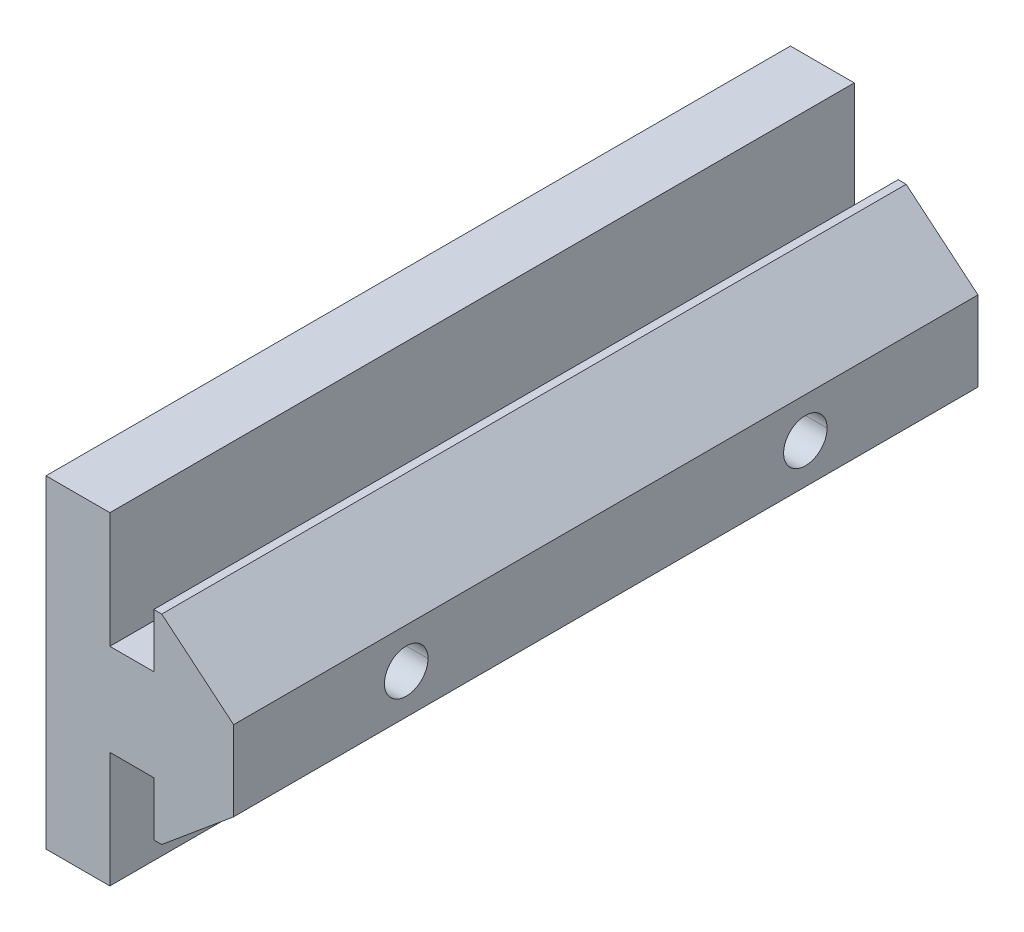
ISO-10303-21;
HEADER;
FILE_DESCRIPTION(('STEP AP214'),'2;1');
FILE_NAME('part.step','',(''),(''),'','','');
FILE_SCHEMA(('AUTOMOTIVE_DESIGN { 1 0 10303 214 1 1 1 1 }'));
ENDSEC;
DATA;
#1=APPLICATION_CONTEXT('core data for automotive mechanical design processes');
#2=APPLICATION_PROTOCOL_DEFINITION('international standard','automotive_design',2000,#1);
#3=PRODUCT_CONTEXT('',#1,'mechanical');
#4=PRODUCT('Part','Part','',(#3));
#5=PRODUCT_RELATED_PRODUCT_CATEGORY('part','',(#4));
#6=PRODUCT_DEFINITION_FORMATION('','',#4);
#7=PRODUCT_DEFINITION_CONTEXT('part definition',#1,'design');
#8=PRODUCT_DEFINITION('design','',#6,#7);
#9=PRODUCT_DEFINITION_SHAPE('','',#8);
#10=(LENGTH_UNIT() NAMED_UNIT(*) SI_UNIT(.MILLI.,.METRE.));
#11=(NAMED_UNIT(*) PLANE_ANGLE_UNIT() SI_UNIT($,.RADIAN.));
#12=(NAMED_UNIT(*) SI_UNIT($,.STERADIAN.) SOLID_ANGLE_UNIT());
#13=UNCERTAINTY_MEASURE_WITH_UNIT(LENGTH_MEASURE(1.E-05),#10,'distance_accuracy_value','');
#14=(GEOMETRIC_REPRESENTATION_CONTEXT(3) GLOBAL_UNCERTAINTY_ASSIGNED_CONTEXT((#13)) GLOBAL_UNIT_ASSIGNED_CONTEXT((#10,
#11,#12)) REPRESENTATION_CONTEXT('',''));
#15=CARTESIAN_POINT('',(0.,0.,0.));
#16=DIRECTION('',(0.,0.,1.));
#17=DIRECTION('',(1.,0.,0.));
#18=AXIS2_PLACEMENT_3D('',#15,#16,#17);
#19=CARTESIAN_POINT('',(-4.064,10.287,23.6855));
#20=DIRECTION('',(1.,0.,0.));
#21=DIRECTION('',(0.,0.,-1.));
#22=AXIS2_PLACEMENT_3D('',#19,#20,#21);
#23=PLANE('',#22);
#24=CARTESIAN_POINT('',(-4.064,0.,-12.7));
#25=DIRECTION('',(-1.,0.,0.));
#26=DIRECTION('',(0.,0.,1.));
#27=AXIS2_PLACEMENT_3D('',#24,#25,#26);
#28=CIRCLE('',#27,1.3843);
#29=CARTESIAN_POINT('',(-4.06399999999999,0.,-14.0843));
#30=VERTEX_POINT('',#29);
#31=CARTESIAN_POINT('',(-4.064,0.,-11.3157));
#32=VERTEX_POINT('',#31);
#33=EDGE_CURVE('E12',#30,#32,#28,.T.);
#34=ORIENTED_EDGE('',*,*,#33,.F.);
#35=CARTESIAN_POINT('',(-4.064,0.,-12.7));
#36=DIRECTION('',(-1.,0.,0.));
#37=DIRECTION('',(0.,0.,1.));
#38=AXIS2_PLACEMENT_3D('',#35,#36,#37);
#39=CIRCLE('',#38,1.3843);
#40=EDGE_CURVE('E29',#32,#30,#39,.T.);
#41=ORIENTED_EDGE('',*,*,#40,.F.);
#42=EDGE_LOOP('',(#34,#41));
#43=FACE_BOUND('',#42,.T.);
#44=CARTESIAN_POINT('',(-4.064,0.,12.7));
#45=DIRECTION('',(-1.,0.,0.));
#46=DIRECTION('',(0.,0.,1.));
#47=AXIS2_PLACEMENT_3D('',#44,#45,#46);
#48=CIRCLE('',#47,1.3843);
#49=CARTESIAN_POINT('',(-4.06399999999999,0.,11.3157));
#50=VERTEX_POINT('',#49);
#51=CARTESIAN_POINT('',(-4.064,0.,14.0843));
#52=VERTEX_POINT('',#51);
#53=EDGE_CURVE('E313',#50,#52,#48,.T.);
#54=ORIENTED_EDGE('',*,*,#53,.F.);
#55=CARTESIAN_POINT('',(-4.064,0.,12.7));
#56=DIRECTION('',(-1.,0.,0.));
#57=DIRECTION('',(0.,0.,1.));
#58=AXIS2_PLACEMENT_3D('',#55,#56,#57);
#59=CIRCLE('',#58,1.3843);
#60=EDGE_CURVE('E316',#52,#50,#59,.T.);
#61=ORIENTED_EDGE('',*,*,#60,.F.);
#62=EDGE_LOOP('',(#54,#61));
#63=FACE_BOUND('',#62,.T.);
#64=DIRECTION('',(0.,-1.,0.));
#65=VECTOR('',#64,1.);
#66=CARTESIAN_POINT('',(-4.064,10.287,-23.6855));
#67=LINE('',#66,#65);
#68=CARTESIAN_POINT('',(-4.064,10.287,-23.6855));
#69=VERTEX_POINT('',#68);
#70=CARTESIAN_POINT('',(-4.064,-10.287,-23.6855));
#71=VERTEX_POINT('',#70);
#72=EDGE_CURVE('E321',#69,#71,#67,.T.);
#73=ORIENTED_EDGE('',*,*,#72,.T.);
#74=DIRECTION('',(0.,0.,-1.));
#75=VECTOR('',#74,1.);
#76=CARTESIAN_POINT('',(-4.064,-10.287,23.6855));
#77=LINE('',#76,#75);
#78=CARTESIAN_POINT('',(-4.064,-10.287,23.6855));
#79=VERTEX_POINT('',#78);
#80=EDGE_CURVE('E160',#79,#71,#77,.T.);
#81=ORIENTED_EDGE('',*,*,#80,.F.);
#82=DIRECTION('',(0.,-1.,0.));
#83=VECTOR('',#82,1.);
#84=CARTESIAN_POINT('',(-4.064,10.287,23.6855));
#85=LINE('',#84,#83);
#86=CARTESIAN_POINT('',(-4.064,10.287,23.6855));
#87=VERTEX_POINT('',#86);
#88=EDGE_CURVE('E349',#87,#79,#85,.T.);
#89=ORIENTED_EDGE('',*,*,#88,.F.);
#90=DIRECTION('',(0.,0.,-1.));
#91=VECTOR('',#90,1.);
#92=CARTESIAN_POINT('',(-4.064,10.287,23.6855));
#93=LINE('',#92,#91);
#94=EDGE_CURVE('E345',#87,#69,#93,.T.);
#95=ORIENTED_EDGE('',*,*,#94,.T.);
#96=EDGE_LOOP('',(#73,#81,#89,#95));
#97=FACE_BOUND('',#96,.T.);
#98=ADVANCED_FACE('F20',(#43,#63,#97),#23,.F.);
#99=CARTESIAN_POINT('',(0.,10.287,23.6855));
#100=DIRECTION('',(0.,-1.,0.));
#101=DIRECTION('',(0.,0.,-1.));
#102=AXIS2_PLACEMENT_3D('',#99,#100,#101);
#103=PLANE('',#102);
#104=DIRECTION('',(-1.,0.,0.));
#105=VECTOR('',#104,1.);
#106=CARTESIAN_POINT('',(0.,10.287,-23.6855));
#107=LINE('',#106,#105);
#108=CARTESIAN_POINT('',(0.,10.287,-23.6855));
#109=VERTEX_POINT('',#108);
#110=EDGE_CURVE('E343',#109,#69,#107,.T.);
#111=ORIENTED_EDGE('',*,*,#110,.T.);
#112=ORIENTED_EDGE('',*,*,#94,.F.);
#113=DIRECTION('',(-1.,0.,0.));
#114=VECTOR('',#113,1.);
#115=CARTESIAN_POINT('',(0.,10.287,23.6855));
#116=LINE('',#115,#114);
#117=CARTESIAN_POINT('',(0.,10.287,23.6855));
#118=VERTEX_POINT('',#117);
#119=EDGE_CURVE('E370',#118,#87,#116,.T.);
#120=ORIENTED_EDGE('',*,*,#119,.F.);
#121=DIRECTION('',(0.,0.,-1.));
#122=VECTOR('',#121,1.);
#123=CARTESIAN_POINT('',(0.,10.287,23.6855));
#124=LINE('',#123,#122);
#125=EDGE_CURVE('E373',#118,#109,#124,.T.);
#126=ORIENTED_EDGE('',*,*,#125,.T.);
#127=EDGE_LOOP('',(#111,#112,#120,#126));
#128=FACE_BOUND('',#127,.T.);
#129=ADVANCED_FACE('F544',(#128),#103,.F.);
#130=CARTESIAN_POINT('',(0.,2.921,23.6855));
#131=DIRECTION('',(-1.,0.,0.));
#132=DIRECTION('',(0.,0.,1.));
#133=AXIS2_PLACEMENT_3D('',#130,#131,#132);
#134=PLANE('',#133);
#135=DIRECTION('',(0.,1.,0.));
#136=VECTOR('',#135,1.);
#137=CARTESIAN_POINT('',(0.,2.921,-23.6855));
#138=LINE('',#137,#136);
#139=CARTESIAN_POINT('',(0.,2.921,-23.6855));
#140=VERTEX_POINT('',#139);
#141=EDGE_CURVE('E367',#140,#109,#138,.T.);
#142=ORIENTED_EDGE('',*,*,#141,.T.);
#143=ORIENTED_EDGE('',*,*,#125,.F.);
#144=DIRECTION('',(0.,1.,0.));
#145=VECTOR('',#144,1.);
#146=CARTESIAN_POINT('',(0.,2.921,23.6855));
#147=LINE('',#146,#145);
#148=CARTESIAN_POINT('',(0.,2.921,23.6855));
#149=VERTEX_POINT('',#148);
#150=EDGE_CURVE('E387',#149,#118,#147,.T.);
#151=ORIENTED_EDGE('',*,*,#150,.F.);
#152=DIRECTION('',(0.,0.,-1.));
#153=VECTOR('',#152,1.);
#154=CARTESIAN_POINT('',(0.,2.921,23.6855));
#155=LINE('',#154,#153);
#156=EDGE_CURVE('E392',#149,#140,#155,.T.);
#157=ORIENTED_EDGE('',*,*,#156,.T.);
#158=EDGE_LOOP('',(#142,#143,#151,#157));
#159=FACE_BOUND('',#158,.T.);
#160=ADVANCED_FACE('F548',(#159),#134,.F.);
#161=CARTESIAN_POINT('',(2.794,2.921,23.6855));
#162=DIRECTION('',(0.,-1.,0.));
#163=DIRECTION('',(0.,0.,-1.));
#164=AXIS2_PLACEMENT_3D('',#161,#162,#163);
#165=PLANE('',#164);
#166=DIRECTION('',(-1.,0.,0.));
#167=VECTOR('',#166,1.);
#168=CARTESIAN_POINT('',(2.794,2.921,-23.6855));
#169=LINE('',#168,#167);
#170=CARTESIAN_POINT('',(2.794,2.921,-23.6855));
#171=VERTEX_POINT('',#170);
#172=EDGE_CURVE('E397',#171,#140,#169,.T.);
#173=ORIENTED_EDGE('',*,*,#172,.T.);
#174=ORIENTED_EDGE('',*,*,#156,.F.);
#175=DIRECTION('',(-1.,0.,0.));
#176=VECTOR('',#175,1.);
#177=CARTESIAN_POINT('',(2.794,2.921,23.6855));
#178=LINE('',#177,#176);
#179=CARTESIAN_POINT('',(2.794,2.921,23.6855));
#180=VERTEX_POINT('',#179);
#181=EDGE_CURVE('E412',#180,#149,#178,.T.);
#182=ORIENTED_EDGE('',*,*,#181,.F.);
#183=DIRECTION('',(0.,0.,-1.));
#184=VECTOR('',#183,1.);
#185=CARTESIAN_POINT('',(2.794,2.921,23.6855));
#186=LINE('',#185,#184);
#187=EDGE_CURVE('E408',#180,#171,#186,.T.);
#188=ORIENTED_EDGE('',*,*,#187,.T.);
#189=EDGE_LOOP('',(#173,#174,#182,#188));
#190=FACE_BOUND('',#189,.T.);
#191=ADVANCED_FACE('F423',(#190),#165,.F.);
#192=CARTESIAN_POINT('',(2.794,6.35,23.6855));
#193=DIRECTION('',(1.,0.,0.));
#194=DIRECTION('',(0.,0.,-1.));
#195=AXIS2_PLACEMENT_3D('',#192,#193,#194);
#196=PLANE('',#195);
#197=DIRECTION('',(0.,-1.,0.));
#198=VECTOR('',#197,1.);
#199=CARTESIAN_POINT('',(2.794,6.35,-23.6855));
#200=LINE('',#199,#198);
#201=CARTESIAN_POINT('',(2.794,6.35,-23.6855));
#202=VERTEX_POINT('',#201);
#203=EDGE_CURVE('E406',#202,#171,#200,.T.);
#204=ORIENTED_EDGE('',*,*,#203,.T.);
#205=ORIENTED_EDGE('',*,*,#187,.F.);
#206=DIRECTION('',(0.,-1.,0.));
#207=VECTOR('',#206,1.);
#208=CARTESIAN_POINT('',(2.794,6.35,23.6855));
#209=LINE('',#208,#207);
#210=CARTESIAN_POINT('',(2.794,6.35,23.6855));
#211=VERTEX_POINT('',#210);
#212=EDGE_CURVE('E433',#211,#180,#209,.T.);
#213=ORIENTED_EDGE('',*,*,#212,.F.);
#214=DIRECTION('',(0.,0.,-1.));
#215=VECTOR('',#214,1.);
#216=CARTESIAN_POINT('',(2.794,6.35,23.6855));
#217=LINE('',#216,#215);
#218=EDGE_CURVE('E435',#211,#202,#217,.T.);
#219=ORIENTED_EDGE('',*,*,#218,.T.);
#220=EDGE_LOOP('',(#204,#205,#213,#219));
#221=FACE_BOUND('',#220,.T.);
#222=ADVANCED_FACE('F557',(#221),#196,.F.);
#223=CARTESIAN_POINT('',(3.302,6.35,23.6855));
#224=DIRECTION('',(0.,-1.,0.));
#225=DIRECTION('',(0.,0.,-1.));
#226=AXIS2_PLACEMENT_3D('',#223,#224,#225);
#227=PLANE('',#226);
#228=DIRECTION('',(-1.,0.,0.));
#229=VECTOR('',#228,1.);
#230=CARTESIAN_POINT('',(3.302,6.35,-23.6855));
#231=LINE('',#230,#229);
#232=CARTESIAN_POINT('',(3.302,6.35,-23.6855));
#233=VERTEX_POINT('',#232);
#234=EDGE_CURVE('E430',#233,#202,#231,.T.);
#235=ORIENTED_EDGE('',*,*,#234,.T.);
#236=ORIENTED_EDGE('',*,*,#218,.F.);
#237=DIRECTION('',(-1.,0.,0.));
#238=VECTOR('',#237,1.);
#239=CARTESIAN_POINT('',(3.302,6.35,23.6855));
#240=LINE('',#239,#238);
#241=CARTESIAN_POINT('',(3.302,6.35,23.6855));
#242=VERTEX_POINT('',#241);
#243=EDGE_CURVE('E448',#242,#211,#240,.T.);
#244=ORIENTED_EDGE('',*,*,#243,.F.);
#245=DIRECTION('',(0.,0.,-1.));
#246=VECTOR('',#245,1.);
#247=CARTESIAN_POINT('',(3.302,6.35,23.6855));
#248=LINE('',#247,#246);
#249=EDGE_CURVE('E261',#242,#233,#248,.T.);
#250=ORIENTED_EDGE('',*,*,#249,.T.);
#251=EDGE_LOOP('',(#235,#236,#244,#250));
#252=FACE_BOUND('',#251,.T.);
#253=ADVANCED_FACE('F457',(#252),#227,.F.);
#254=CARTESIAN_POINT('',(7.874,2.54,23.6855));
#255=DIRECTION('',(-0.64018439966448,-0.768221279597376,0.));
#256=DIRECTION('',(0.768221279597376,-0.64018439966448,0.));
#257=AXIS2_PLACEMENT_3D('',#254,#255,#256);
#258=PLANE('',#257);
#259=DIRECTION('',(-0.768221279597376,0.64018439966448,0.));
#260=VECTOR('',#259,1.);
#261=CARTESIAN_POINT('',(7.874,2.54,-23.6855));
#262=LINE('',#261,#260);
#263=CARTESIAN_POINT('',(7.874,2.54,-23.6855));
#264=VERTEX_POINT('',#263);
#265=EDGE_CURVE('E255',#264,#233,#262,.T.);
#266=ORIENTED_EDGE('',*,*,#265,.T.);
#267=ORIENTED_EDGE('',*,*,#249,.F.);
#268=DIRECTION('',(-0.768221279597376,0.64018439966448,0.));
#269=VECTOR('',#268,1.);
#270=CARTESIAN_POINT('',(7.874,2.54,23.6855));
#271=LINE('',#270,#269);
#272=CARTESIAN_POINT('',(7.874,2.54,23.6855));
#273=VERTEX_POINT('',#272);
#274=EDGE_CURVE('E249',#273,#242,#271,.T.);
#275=ORIENTED_EDGE('',*,*,#274,.F.);
#276=DIRECTION('',(0.,0.,-1.));
#277=VECTOR('',#276,1.);
#278=CARTESIAN_POINT('',(7.874,2.54,23.6855));
#279=LINE('',#278,#277);
#280=EDGE_CURVE('E236',#273,#264,#279,.T.);
#281=ORIENTED_EDGE('',*,*,#280,.T.);
#282=EDGE_LOOP('',(#266,#267,#275,#281));
#283=FACE_BOUND('',#282,.T.);
#284=ADVANCED_FACE('F459',(#283),#258,.F.);
#285=CARTESIAN_POINT('',(7.874,-2.54,23.6855));
#286=DIRECTION('',(-1.,0.,0.));
#287=DIRECTION('',(0.,0.,1.));
#288=AXIS2_PLACEMENT_3D('',#285,#286,#287);
#289=PLANE('',#288);
#290=CARTESIAN_POINT('',(7.874,0.,-12.7));
#291=DIRECTION('',(-1.,0.,0.));
#292=DIRECTION('',(0.,0.,1.));
#293=AXIS2_PLACEMENT_3D('',#290,#291,#292);
#294=CIRCLE('',#293,1.3843);
#295=CARTESIAN_POINT('',(7.874,0.,-11.3157));
#296=VERTEX_POINT('',#295);
#297=CARTESIAN_POINT('',(7.874,0.,-14.0843));
#298=VERTEX_POINT('',#297);
#299=EDGE_CURVE('E225',#296,#298,#294,.T.);
#300=ORIENTED_EDGE('',*,*,#299,.T.);
#301=CARTESIAN_POINT('',(7.874,0.,-12.7));
#302=DIRECTION('',(-1.,0.,0.));
#303=DIRECTION('',(0.,0.,1.));
#304=AXIS2_PLACEMENT_3D('',#301,#302,#303);
#305=CIRCLE('',#304,1.3843);
#306=EDGE_CURVE('E229',#298,#296,#305,.T.);
#307=ORIENTED_EDGE('',*,*,#306,.T.);
#308=EDGE_LOOP('',(#300,#307));
#309=FACE_BOUND('',#308,.T.);
#310=CARTESIAN_POINT('',(7.874,0.,12.7));
#311=DIRECTION('',(-1.,0.,0.));
#312=DIRECTION('',(0.,0.,1.));
#313=AXIS2_PLACEMENT_3D('',#310,#311,#312);
#314=CIRCLE('',#313,1.3843);
#315=CARTESIAN_POINT('',(7.874,0.,14.0843));
#316=VERTEX_POINT('',#315);
#317=CARTESIAN_POINT('',(7.874,0.,11.3157));
#318=VERTEX_POINT('',#317);
#319=EDGE_CURVE('E232',#316,#318,#314,.T.);
#320=ORIENTED_EDGE('',*,*,#319,.T.);
#321=CARTESIAN_POINT('',(7.874,0.,12.7));
#322=DIRECTION('',(-1.,0.,0.));
#323=DIRECTION('',(0.,0.,1.));
#324=AXIS2_PLACEMENT_3D('',#321,#322,#323);
#325=CIRCLE('',#324,1.3843);
#326=EDGE_CURVE('E238',#318,#316,#325,.T.);
#327=ORIENTED_EDGE('',*,*,#326,.T.);
#328=EDGE_LOOP('',(#320,#327));
#329=FACE_BOUND('',#328,.T.);
#330=DIRECTION('',(0.,1.,0.));
#331=VECTOR('',#330,1.);
#332=CARTESIAN_POINT('',(7.874,-2.54,-23.6855));
#333=LINE('',#332,#331);
#334=CARTESIAN_POINT('',(7.874,-2.54,-23.6855));
#335=VERTEX_POINT('',#334);
#336=EDGE_CURVE('E289',#335,#264,#333,.T.);
#337=ORIENTED_EDGE('',*,*,#336,.T.);
#338=ORIENTED_EDGE('',*,*,#280,.F.);
#339=DIRECTION('',(0.,1.,0.));
#340=VECTOR('',#339,1.);
#341=CARTESIAN_POINT('',(7.874,-2.54,23.6855));
#342=LINE('',#341,#340);
#343=CARTESIAN_POINT('',(7.874,-2.54,23.6855));
#344=VERTEX_POINT('',#343);
#345=EDGE_CURVE('E283',#344,#273,#342,.T.);
#346=ORIENTED_EDGE('',*,*,#345,.F.);
#347=DIRECTION('',(0.,0.,-1.));
#348=VECTOR('',#347,1.);
#349=CARTESIAN_POINT('',(7.874,-2.54,23.6855));
#350=LINE('',#349,#348);
#351=EDGE_CURVE('E279',#344,#335,#350,.T.);
#352=ORIENTED_EDGE('',*,*,#351,.T.);
#353=EDGE_LOOP('',(#337,#338,#346,#352));
#354=FACE_BOUND('',#353,.T.);
#355=ADVANCED_FACE('F303',(#309,#329,#354),#289,.F.);
#356=CARTESIAN_POINT('',(3.302,-6.35,23.6855));
#357=DIRECTION('',(-0.64018439966448,0.768221279597376,0.));
#358=DIRECTION('',(-0.768221279597376,-0.64018439966448,0.));
#359=AXIS2_PLACEMENT_3D('',#356,#357,#358);
#360=PLANE('',#359);
#361=DIRECTION('',(0.768221279597376,0.64018439966448,0.));
#362=VECTOR('',#361,1.);
#363=CARTESIAN_POINT('',(3.302,-6.35,-23.6855));
#364=LINE('',#363,#362);
#365=CARTESIAN_POINT('',(3.302,-6.35,-23.6855));
#366=VERTEX_POINT('',#365);
#367=EDGE_CURVE('E277',#366,#335,#364,.T.);
#368=ORIENTED_EDGE('',*,*,#367,.T.);
#369=ORIENTED_EDGE('',*,*,#351,.F.);
#370=DIRECTION('',(0.768221279597376,0.64018439966448,0.));
#371=VECTOR('',#370,1.);
#372=CARTESIAN_POINT('',(3.302,-6.35,23.6855));
#373=LINE('',#372,#371);
#374=CARTESIAN_POINT('',(3.302,-6.35,23.6855));
#375=VERTEX_POINT('',#374);
#376=EDGE_CURVE('E473',#375,#344,#373,.T.);
#377=ORIENTED_EDGE('',*,*,#376,.F.);
#378=DIRECTION('',(0.,0.,-1.));
#379=VECTOR('',#378,1.);
#380=CARTESIAN_POINT('',(3.302,-6.35,23.6855));
#381=LINE('',#380,#379);
#382=EDGE_CURVE('E470',#375,#366,#381,.T.);
#383=ORIENTED_EDGE('',*,*,#382,.T.);
#384=EDGE_LOOP('',(#368,#369,#377,#383));
#385=FACE_BOUND('',#384,.T.);
#386=ADVANCED_FACE('F468',(#385),#360,.F.);
#387=CARTESIAN_POINT('',(2.794,-6.35,23.6855));
#388=DIRECTION('',(0.,1.,0.));
#389=DIRECTION('',(0.,0.,1.));
#390=AXIS2_PLACEMENT_3D('',#387,#388,#389);
#391=PLANE('',#390);
#392=DIRECTION('',(1.,0.,0.));
#393=VECTOR('',#392,1.);
#394=CARTESIAN_POINT('',(2.794,-6.35,-23.6855));
#395=LINE('',#394,#393);
#396=CARTESIAN_POINT('',(2.794,-6.35,-23.6855));
#397=VERTEX_POINT('',#396);
#398=EDGE_CURVE('E478',#397,#366,#395,.T.);
#399=ORIENTED_EDGE('',*,*,#398,.T.);
#400=ORIENTED_EDGE('',*,*,#382,.F.);
#401=DIRECTION('',(1.,0.,0.));
#402=VECTOR('',#401,1.);
#403=CARTESIAN_POINT('',(2.794,-6.35,23.6855));
#404=LINE('',#403,#402);
#405=CARTESIAN_POINT('',(2.794,-6.35,23.6855));
#406=VERTEX_POINT('',#405);
#407=EDGE_CURVE('E488',#406,#375,#404,.T.);
#408=ORIENTED_EDGE('',*,*,#407,.F.);
#409=DIRECTION('',(0.,0.,-1.));
#410=VECTOR('',#409,1.);
#411=CARTESIAN_POINT('',(2.794,-6.35,23.6855));
#412=LINE('',#411,#410);
#413=EDGE_CURVE('E493',#406,#397,#412,.T.);
#414=ORIENTED_EDGE('',*,*,#413,.T.);
#415=EDGE_LOOP('',(#399,#400,#408,#414));
#416=FACE_BOUND('',#415,.T.);
#417=ADVANCED_FACE('F533',(#416),#391,.F.);
#418=CARTESIAN_POINT('',(2.794,-2.921,23.6855));
#419=DIRECTION('',(1.,0.,0.));
#420=DIRECTION('',(0.,0.,-1.));
#421=AXIS2_PLACEMENT_3D('',#418,#419,#420);
#422=PLANE('',#421);
#423=DIRECTION('',(0.,-1.,0.));
#424=VECTOR('',#423,1.);
#425=CARTESIAN_POINT('',(2.794,-2.921,-23.6855));
#426=LINE('',#425,#424);
#427=CARTESIAN_POINT('',(2.794,-2.921,-23.6855));
#428=VERTEX_POINT('',#427);
#429=EDGE_CURVE('E498',#428,#397,#426,.T.);
#430=ORIENTED_EDGE('',*,*,#429,.T.);
#431=ORIENTED_EDGE('',*,*,#413,.F.);
#432=DIRECTION('',(0.,-1.,0.));
#433=VECTOR('',#432,1.);
#434=CARTESIAN_POINT('',(2.794,-2.921,23.6855));
#435=LINE('',#434,#433);
#436=CARTESIAN_POINT('',(2.794,-2.921,23.6855));
#437=VERTEX_POINT('',#436);
#438=EDGE_CURVE('E505',#437,#406,#435,.T.);
#439=ORIENTED_EDGE('',*,*,#438,.F.);
#440=DIRECTION('',(0.,0.,-1.));
#441=VECTOR('',#440,1.);
#442=CARTESIAN_POINT('',(2.794,-2.921,23.6855));
#443=LINE('',#442,#441);
#444=EDGE_CURVE('E511',#437,#428,#443,.T.);
#445=ORIENTED_EDGE('',*,*,#444,.T.);
#446=EDGE_LOOP('',(#430,#431,#439,#445));
#447=FACE_BOUND('',#446,.T.);
#448=ADVANCED_FACE('F531',(#447),#422,.F.);
#449=CARTESIAN_POINT('',(0.,-2.921,23.6855));
#450=DIRECTION('',(0.,1.,0.));
#451=DIRECTION('',(0.,0.,1.));
#452=AXIS2_PLACEMENT_3D('',#449,#450,#451);
#453=PLANE('',#452);
#454=DIRECTION('',(1.,0.,0.));
#455=VECTOR('',#454,1.);
#456=CARTESIAN_POINT('',(0.,-2.921,-23.6855));
#457=LINE('',#456,#455);
#458=CARTESIAN_POINT('',(0.,-2.921,-23.6855));
#459=VERTEX_POINT('',#458);
#460=EDGE_CURVE('E169',#459,#428,#457,.T.);
#461=ORIENTED_EDGE('',*,*,#460,.T.);
#462=ORIENTED_EDGE('',*,*,#444,.F.);
#463=DIRECTION('',(1.,0.,0.));
#464=VECTOR('',#463,1.);
#465=CARTESIAN_POINT('',(0.,-2.921,23.6855));
#466=LINE('',#465,#464);
#467=CARTESIAN_POINT('',(0.,-2.921,23.6855));
#468=VERTEX_POINT('',#467);
#469=EDGE_CURVE('E176',#468,#437,#466,.T.);
#470=ORIENTED_EDGE('',*,*,#469,.F.);
#471=DIRECTION('',(0.,0.,-1.));
#472=VECTOR('',#471,1.);
#473=CARTESIAN_POINT('',(0.,-2.921,23.6855));
#474=LINE('',#473,#472);
#475=EDGE_CURVE('E171',#468,#459,#474,.T.);
#476=ORIENTED_EDGE('',*,*,#475,.T.);
#477=EDGE_LOOP('',(#461,#462,#470,#476));
#478=FACE_BOUND('',#477,.T.);
#479=ADVANCED_FACE('F529',(#478),#453,.F.);
#480=CARTESIAN_POINT('',(0.,-10.287,23.6855));
#481=DIRECTION('',(-1.,0.,0.));
#482=DIRECTION('',(0.,0.,1.));
#483=AXIS2_PLACEMENT_3D('',#480,#481,#482);
#484=PLANE('',#483);
#485=DIRECTION('',(0.,1.,0.));
#486=VECTOR('',#485,1.);
#487=CARTESIAN_POINT('',(0.,-10.287,-23.6855));
#488=LINE('',#487,#486);
#489=CARTESIAN_POINT('',(0.,-10.287,-23.6855));
#490=VERTEX_POINT('',#489);
#491=EDGE_CURVE('E147',#490,#459,#488,.T.);
#492=ORIENTED_EDGE('',*,*,#491,.T.);
#493=ORIENTED_EDGE('',*,*,#475,.F.);
#494=DIRECTION('',(0.,1.,0.));
#495=VECTOR('',#494,1.);
#496=CARTESIAN_POINT('',(0.,-10.287,23.6855));
#497=LINE('',#496,#495);
#498=CARTESIAN_POINT('',(0.,-10.287,23.6855));
#499=VERTEX_POINT('',#498);
#500=EDGE_CURVE('E150',#499,#468,#497,.T.);
#501=ORIENTED_EDGE('',*,*,#500,.F.);
#502=DIRECTION('',(0.,0.,-1.));
#503=VECTOR('',#502,1.);
#504=CARTESIAN_POINT('',(0.,-10.287,23.6855));
#505=LINE('',#504,#503);
#506=EDGE_CURVE('E142',#499,#490,#505,.T.);
#507=ORIENTED_EDGE('',*,*,#506,.T.);
#508=EDGE_LOOP('',(#492,#493,#501,#507));
#509=FACE_BOUND('',#508,.T.);
#510=ADVANCED_FACE('F144',(#509),#484,.F.);
#511=CARTESIAN_POINT('',(-4.064,-10.287,23.6855));
#512=DIRECTION('',(0.,1.,0.));
#513=DIRECTION('',(0.,0.,1.));
#514=AXIS2_PLACEMENT_3D('',#511,#512,#513);
#515=PLANE('',#514);
#516=DIRECTION('',(1.,0.,0.));
#517=VECTOR('',#516,1.);
#518=CARTESIAN_POINT('',(-4.064,-10.287,-23.6855));
#519=LINE('',#518,#517);
#520=EDGE_CURVE('E155',#71,#490,#519,.T.);
#521=ORIENTED_EDGE('',*,*,#520,.T.);
#522=ORIENTED_EDGE('',*,*,#506,.F.);
#523=DIRECTION('',(1.,0.,0.));
#524=VECTOR('',#523,1.);
#525=CARTESIAN_POINT('',(-4.064,-10.287,23.6855));
#526=LINE('',#525,#524);
#527=EDGE_CURVE('E164',#79,#499,#526,.T.);
#528=ORIENTED_EDGE('',*,*,#527,.F.);
#529=ORIENTED_EDGE('',*,*,#80,.T.);
#530=EDGE_LOOP('',(#521,#522,#528,#529));
#531=FACE_BOUND('',#530,.T.);
#532=ADVANCED_FACE('F159',(#531),#515,.F.);
#533=CARTESIAN_POINT('',(0.,0.,23.6855));
#534=DIRECTION('',(0.,0.,1.));
#535=DIRECTION('',(1.,0.,0.));
#536=AXIS2_PLACEMENT_3D('',#533,#534,#535);
#537=PLANE('',#536);
#538=ORIENTED_EDGE('',*,*,#88,.T.);
#539=ORIENTED_EDGE('',*,*,#527,.T.);
#540=ORIENTED_EDGE('',*,*,#500,.T.);
#541=ORIENTED_EDGE('',*,*,#469,.T.);
#542=ORIENTED_EDGE('',*,*,#438,.T.);
#543=ORIENTED_EDGE('',*,*,#407,.T.);
#544=ORIENTED_EDGE('',*,*,#376,.T.);
#545=ORIENTED_EDGE('',*,*,#345,.T.);
#546=ORIENTED_EDGE('',*,*,#274,.T.);
#547=ORIENTED_EDGE('',*,*,#243,.T.);
#548=ORIENTED_EDGE('',*,*,#212,.T.);
#549=ORIENTED_EDGE('',*,*,#181,.T.);
#550=ORIENTED_EDGE('',*,*,#150,.T.);
#551=ORIENTED_EDGE('',*,*,#119,.T.);
#552=EDGE_LOOP('',(#538,#539,#540,#541,#542,#543,#544,#545,#546,#547,#548,#549,#550,#551));
#553=FACE_BOUND('',#552,.T.);
#554=ADVANCED_FACE('F525',(#553),#537,.T.);
#555=CARTESIAN_POINT('',(0.,0.,-23.6855));
#556=DIRECTION('',(0.,0.,1.));
#557=DIRECTION('',(1.,0.,0.));
#558=AXIS2_PLACEMENT_3D('',#555,#556,#557);
#559=PLANE('',#558);
#560=ORIENTED_EDGE('',*,*,#72,.F.);
#561=ORIENTED_EDGE('',*,*,#110,.F.);
#562=ORIENTED_EDGE('',*,*,#141,.F.);
#563=ORIENTED_EDGE('',*,*,#172,.F.);
#564=ORIENTED_EDGE('',*,*,#203,.F.);
#565=ORIENTED_EDGE('',*,*,#234,.F.);
#566=ORIENTED_EDGE('',*,*,#265,.F.);
#567=ORIENTED_EDGE('',*,*,#336,.F.);
#568=ORIENTED_EDGE('',*,*,#367,.F.);
#569=ORIENTED_EDGE('',*,*,#398,.F.);
#570=ORIENTED_EDGE('',*,*,#429,.F.);
#571=ORIENTED_EDGE('',*,*,#460,.F.);
#572=ORIENTED_EDGE('',*,*,#491,.F.);
#573=ORIENTED_EDGE('',*,*,#520,.F.);
#574=EDGE_LOOP('',(#560,#561,#562,#563,#564,#565,#566,#567,#568,#569,#570,#571,#572,#573));
#575=FACE_BOUND('',#574,.T.);
#576=ADVANCED_FACE('F166',(#575),#559,.F.);
#577=CARTESIAN_POINT('',(-4.064,0.,12.7));
#578=DIRECTION('',(-1.,0.,0.));
#579=DIRECTION('',(0.,1.,0.));
#580=AXIS2_PLACEMENT_3D('',#577,#578,#579);
#581=CYLINDRICAL_SURFACE('',#580,1.3843);
#582=DIRECTION('',(-1.,0.,0.));
#583=VECTOR('',#582,1.);
#584=CARTESIAN_POINT('',(7.874,0.,11.3157));
#585=LINE('',#584,#583);
#586=EDGE_CURVE('E199',#318,#50,#585,.T.);
#587=ORIENTED_EDGE('',*,*,#586,.T.);
#588=ORIENTED_EDGE('',*,*,#53,.T.);
#589=DIRECTION('',(-1.,0.,0.));
#590=VECTOR('',#589,1.);
#591=CARTESIAN_POINT('',(7.874,0.,14.0843));
#592=LINE('',#591,#590);
#593=EDGE_CURVE('E205',#316,#52,#592,.T.);
#594=ORIENTED_EDGE('',*,*,#593,.F.);
#595=ORIENTED_EDGE('',*,*,#326,.F.);
#596=EDGE_LOOP('',(#587,#588,#594,#595));
#597=FACE_BOUND('',#596,.T.);
#598=ADVANCED_FACE('F312',(#597),#581,.F.);
#599=CARTESIAN_POINT('',(-4.064,0.,12.7));
#600=DIRECTION('',(-1.,0.,0.));
#601=DIRECTION('',(0.,-1.,0.));
#602=AXIS2_PLACEMENT_3D('',#599,#600,#601);
#603=CYLINDRICAL_SURFACE('',#602,1.3843);
#604=ORIENTED_EDGE('',*,*,#586,.F.);
#605=ORIENTED_EDGE('',*,*,#319,.F.);
#606=ORIENTED_EDGE('',*,*,#593,.T.);
#607=ORIENTED_EDGE('',*,*,#60,.T.);
#608=EDGE_LOOP('',(#604,#605,#606,#607));
#609=FACE_BOUND('',#608,.T.);
#610=ADVANCED_FACE('F309',(#609),#603,.F.);
#611=CARTESIAN_POINT('',(-4.064,0.,-12.7));
#612=DIRECTION('',(-1.,0.,0.));
#613=DIRECTION('',(0.,1.,0.));
#614=AXIS2_PLACEMENT_3D('',#611,#612,#613);
#615=CYLINDRICAL_SURFACE('',#614,1.3843);
#616=DIRECTION('',(-1.,0.,0.));
#617=VECTOR('',#616,1.);
#618=CARTESIAN_POINT('',(7.874,0.,-14.0843));
#619=LINE('',#618,#617);
#620=EDGE_CURVE('E211',#298,#30,#619,.T.);
#621=ORIENTED_EDGE('',*,*,#620,.T.);
#622=ORIENTED_EDGE('',*,*,#33,.T.);
#623=DIRECTION('',(-1.,0.,0.));
#624=VECTOR('',#623,1.);
#625=CARTESIAN_POINT('',(7.874,0.,-11.3157));
#626=LINE('',#625,#624);
#627=EDGE_CURVE('E216',#296,#32,#626,.T.);
#628=ORIENTED_EDGE('',*,*,#627,.F.);
#629=ORIENTED_EDGE('',*,*,#306,.F.);
#630=EDGE_LOOP('',(#621,#622,#628,#629));
#631=FACE_BOUND('',#630,.T.);
#632=ADVANCED_FACE('F228',(#631),#615,.F.);
#633=CARTESIAN_POINT('',(-4.064,0.,-12.7));
#634=DIRECTION('',(-1.,0.,0.));
#635=DIRECTION('',(0.,-1.,0.));
#636=AXIS2_PLACEMENT_3D('',#633,#634,#635);
#637=CYLINDRICAL_SURFACE('',#636,1.3843);
#638=ORIENTED_EDGE('',*,*,#620,.F.);
#639=ORIENTED_EDGE('',*,*,#299,.F.);
#640=ORIENTED_EDGE('',*,*,#627,.T.);
#641=ORIENTED_EDGE('',*,*,#40,.T.);
#642=EDGE_LOOP('',(#638,#639,#640,#641));
#643=FACE_BOUND('',#642,.T.);
#644=ADVANCED_FACE('F224',(#643),#637,.F.);
#645=CLOSED_SHELL('',(#98,#129,#160,#191,#222,#253,#284,#355,#386,#417,#448,#479,#510,#532,#554,
#576,#598,#610,#632,#644));
#646=MANIFOLD_SOLID_BREP('B1',#645);
#647=ADVANCED_BREP_SHAPE_REPRESENTATION('',(#18,#646),#14);
#648=SHAPE_DEFINITION_REPRESENTATION(#9,#647);
ENDSEC;
END-ISO-10303-21;
